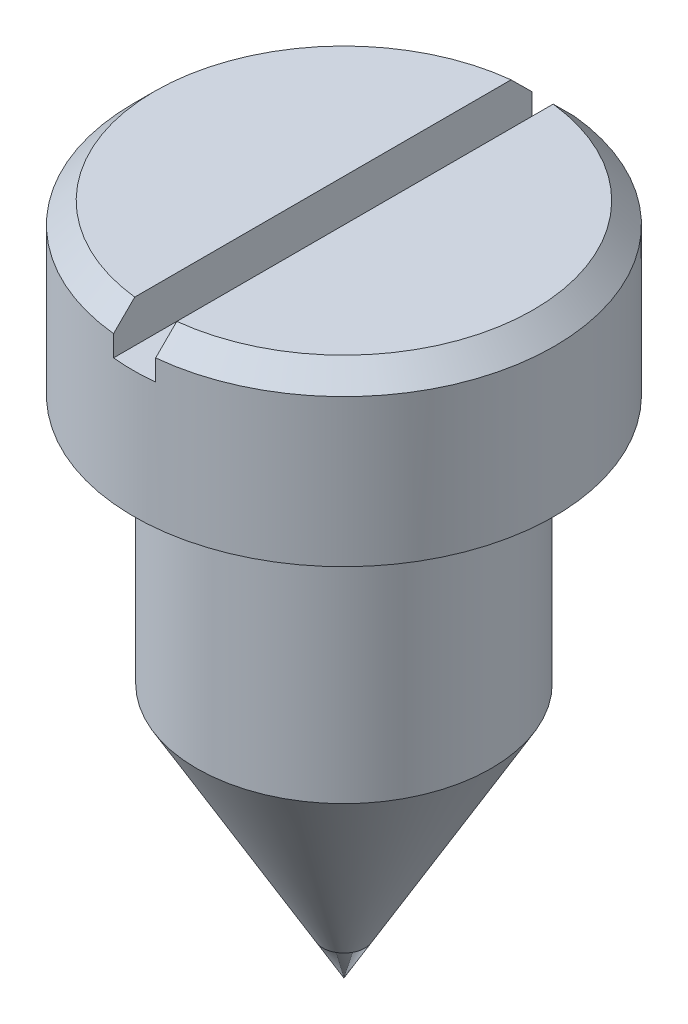
ISO-10303-21;
HEADER;
FILE_DESCRIPTION(('STEP AP214'),'2;1');
FILE_NAME('part.step','',(''),(''),'','','');
FILE_SCHEMA(('AUTOMOTIVE_DESIGN { 1 0 10303 214 1 1 1 1 }'));
ENDSEC;
DATA;
#1=APPLICATION_CONTEXT('core data for automotive mechanical design processes');
#2=APPLICATION_PROTOCOL_DEFINITION('international standard','automotive_design',2000,#1);
#3=PRODUCT_CONTEXT('',#1,'mechanical');
#4=PRODUCT('Part','Part','',(#3));
#5=PRODUCT_RELATED_PRODUCT_CATEGORY('part','',(#4));
#6=PRODUCT_DEFINITION_FORMATION('','',#4);
#7=PRODUCT_DEFINITION_CONTEXT('part definition',#1,'design');
#8=PRODUCT_DEFINITION('design','',#6,#7);
#9=PRODUCT_DEFINITION_SHAPE('','',#8);
#10=(LENGTH_UNIT() NAMED_UNIT(*) SI_UNIT(.MILLI.,.METRE.));
#11=(NAMED_UNIT(*) PLANE_ANGLE_UNIT() SI_UNIT($,.RADIAN.));
#12=(NAMED_UNIT(*) SI_UNIT($,.STERADIAN.) SOLID_ANGLE_UNIT());
#13=UNCERTAINTY_MEASURE_WITH_UNIT(LENGTH_MEASURE(1.E-05),#10,'distance_accuracy_value','');
#14=(GEOMETRIC_REPRESENTATION_CONTEXT(3) GLOBAL_UNCERTAINTY_ASSIGNED_CONTEXT((#13)) GLOBAL_UNIT_ASSIGNED_CONTEXT((#10,
#11,#12)) REPRESENTATION_CONTEXT('',''));
#15=CARTESIAN_POINT('',(0.,0.,0.));
#16=DIRECTION('',(0.,0.,1.));
#17=DIRECTION('',(1.,0.,0.));
#18=AXIS2_PLACEMENT_3D('',#15,#16,#17);
#19=CARTESIAN_POINT('',(5.,16.,0.));
#20=DIRECTION('',(0.,-1.,0.));
#21=DIRECTION('',(1.,0.,0.));
#22=AXIS2_PLACEMENT_3D('',#19,#20,#21);
#23=PLANE('',#22);
#24=CARTESIAN_POINT('',(0.,16.,0.));
#25=DIRECTION('',(0.,-1.,0.));
#26=DIRECTION('',(1.,0.,0.));
#27=AXIS2_PLACEMENT_3D('',#24,#25,#26);
#28=CIRCLE('',#27,4.5);
#29=CARTESIAN_POINT('',(0.5,16.,4.47213595499958));
#30=VERTEX_POINT('',#29);
#31=CARTESIAN_POINT('',(0.5,16.,-4.47213595499958));
#32=VERTEX_POINT('',#31);
#33=EDGE_CURVE('E151',#30,#32,#28,.F.);
#34=ORIENTED_EDGE('',*,*,#33,.T.);
#35=DIRECTION('',(0.,0.,1.));
#36=VECTOR('',#35,1.);
#37=CARTESIAN_POINT('',(0.5,16.,0.));
#38=LINE('',#37,#36);
#39=EDGE_CURVE('E119',#32,#30,#38,.T.);
#40=ORIENTED_EDGE('',*,*,#39,.T.);
#41=EDGE_LOOP('',(#34,#40));
#42=FACE_BOUND('',#41,.T.);
#43=ADVANCED_FACE('F41',(#42),#23,.F.);
#44=CARTESIAN_POINT('',(0.,16.,0.));
#45=DIRECTION('',(0.,-1.,0.));
#46=DIRECTION('',(1.,0.,0.));
#47=AXIS2_PLACEMENT_3D('',#44,#45,#46);
#48=CONICAL_SURFACE('',#47,4.5,0.785398163397447);
#49=CARTESIAN_POINT('',(0.5,15.4993,4.97564071150641));
#50=CARTESIAN_POINT('',(0.5,15.6486362931202,4.8255487609575));
#51=CARTESIAN_POINT('',(0.5,15.7979420463132,4.67542639804808));
#52=CARTESIAN_POINT('',(0.5,16.0964794145826,4.37507417019014));
#53=CARTESIAN_POINT('',(0.5,16.2457110193444,4.22484429498999));
#54=CARTESIAN_POINT('',(0.5,16.5444813312987,3.92383299920542));
#55=CARTESIAN_POINT('',(0.5,16.694019690574,3.77305123316817));
#56=CARTESIAN_POINT('',(0.5,16.9929046527164,3.47133111208202));
#57=CARTESIAN_POINT('',(0.5,17.142251275111,3.32039277637426));
#58=CARTESIAN_POINT('',(0.5,17.4858545688809,2.97254761806295));
#59=CARTESIAN_POINT('',(0.499999999999999,17.6800235002175,2.77555399533727));
#60=CARTESIAN_POINT('',(0.499999999999999,17.9707166779711,2.47943912144982));
#61=CARTESIAN_POINT('',(0.499999999999999,18.0675394981215,2.38061112921131));
#62=CARTESIAN_POINT('',(0.499999999999999,18.2608896355566,2.18267434936266));
#63=CARTESIAN_POINT('',(0.499999999999999,18.3574169648297,2.08356557346705));
#64=CARTESIAN_POINT('',(0.499999999999999,18.5497999906764,1.8851713826513));
#65=CARTESIAN_POINT('',(0.499999999999999,18.6456567568779,1.78588700731163));
#66=CARTESIAN_POINT('',(0.499999999999999,18.8366878224458,1.58663425437869));
#67=CARTESIAN_POINT('',(0.499999999999999,18.9318620130895,1.48666577256574));
#68=CARTESIAN_POINT('',(0.499999999999999,19.1209574605125,1.28567493429638));
#69=CARTESIAN_POINT('',(0.499999999999999,19.214879565198,1.18465338323188));
#70=CARTESIAN_POINT('',(0.499999999999999,19.3539236485399,1.0314715660579));
#71=CARTESIAN_POINT('',(0.499999999999999,19.3999595103523,0.98014258068809));
#72=CARTESIAN_POINT('',(0.499999999999999,19.4910853409493,0.876653535934318));
#73=CARTESIAN_POINT('',(0.499999999999999,19.5361754046692,0.824493560895263));
#74=CARTESIAN_POINT('',(0.499999999999999,19.5981021360247,0.750697887438908));
#75=CARTESIAN_POINT('',(0.499999999999999,19.6155904005098,0.729609551143389));
#76=CARTESIAN_POINT('',(0.499999999999999,19.6502568895439,0.687177526358408));
#77=CARTESIAN_POINT('',(0.499999999999999,19.667435098672,0.665833825255396));
#78=CARTESIAN_POINT('',(0.499999999999999,19.7184559951259,0.601260894504368));
#79=CARTESIAN_POINT('',(0.499999999999999,19.7517172702286,0.557569432540582));
#80=CARTESIAN_POINT('',(0.499999999999999,19.8151043888577,0.469075574852688));
#81=CARTESIAN_POINT('',(0.499999999999999,19.8452754494756,0.424306721749482));
#82=CARTESIAN_POINT('',(0.499999999999999,19.8870061308774,0.35509412489074));
#83=CARTESIAN_POINT('',(0.499999999999999,19.900312979125,0.331713261391649));
#84=CARTESIAN_POINT('',(0.499999999999999,19.9252837532308,0.284097612249944));
#85=CARTESIAN_POINT('',(0.499999999999999,19.9369491309563,0.259863605232308));
#86=CARTESIAN_POINT('',(0.499999999999999,19.9540577087911,0.219654251860777));
#87=CARTESIAN_POINT('',(0.499999999999999,19.9601969337127,0.203977411003732));
#88=CARTESIAN_POINT('',(0.499999999999999,19.9713755603666,0.172237070387167));
#89=CARTESIAN_POINT('',(0.499999999999999,19.976414872655,0.15617353930018));
#90=CARTESIAN_POINT('',(0.499999999999999,19.9894878576618,0.107622738760476));
#91=CARTESIAN_POINT('',(0.499999999999999,19.9955740080711,0.0745602390323407));
#92=CARTESIAN_POINT('',(0.499999999999999,20.0010665746046,0.00747674496532225));
#93=CARTESIAN_POINT('',(0.499999999999999,20.0003971645643,-0.0265508450907743));
#94=CARTESIAN_POINT('',(0.499999999999999,19.9923747707513,-0.0939003718127626));
#95=CARTESIAN_POINT('',(0.499999999999999,19.9849928191224,-0.12721860894651));
#96=CARTESIAN_POINT('',(0.499999999999999,19.9679101069927,-0.183392884883674));
#97=CARTESIAN_POINT('',(0.499999999999999,19.9593836294813,-0.206632741335923));
#98=CARTESIAN_POINT('',(0.499999999999999,19.9403384047716,-0.252291655115592));
#99=CARTESIAN_POINT('',(0.499999999999999,19.9298182383423,-0.274710114071584));
#100=CARTESIAN_POINT('',(0.499999999999999,19.907271573312,-0.318889179156411));
#101=CARTESIAN_POINT('',(0.499999999999999,19.8952385364533,-0.340646387528582));
#102=CARTESIAN_POINT('',(0.499999999999999,19.8700942051218,-0.383510532285601));
#103=CARTESIAN_POINT('',(0.499999999999999,19.8569833412728,-0.404617723782758));
#104=CARTESIAN_POINT('',(0.499999999999999,19.8114880478408,-0.474848363799689));
#105=CARTESIAN_POINT('',(0.499999999999999,19.7772814341244,-0.522783093895099));
#106=CARTESIAN_POINT('',(0.499999999999999,19.7065161684866,-0.616896543236326));
#107=CARTESIAN_POINT('',(0.499999999999999,19.6699553015965,-0.66307354179877));
#108=CARTESIAN_POINT('',(0.499999999999999,19.595336660205,-0.754393204189006));
#109=CARTESIAN_POINT('',(0.499999999999999,19.5572753419569,-0.799532964663511));
#110=CARTESIAN_POINT('',(0.499999999999999,19.4802754555456,-0.889018744780219));
#111=CARTESIAN_POINT('',(0.499999999999999,19.4413372617079,-0.93336508913795));
#112=CARTESIAN_POINT('',(0.499999999999999,19.3626881437261,-1.02170637284883));
#113=CARTESIAN_POINT('',(0.499999999999999,19.3229746282958,-1.06569900034567));
#114=CARTESIAN_POINT('',(0.499999999999999,19.2431122888391,-1.15329466677066));
#115=CARTESIAN_POINT('',(0.499999999999999,19.2029634202663,-1.19689766498246));
#116=CARTESIAN_POINT('',(0.499999999999999,19.082179077046,-1.32713118001123));
#117=CARTESIAN_POINT('',(0.499999999999999,19.0010774069478,-1.41332877717749));
#118=CARTESIAN_POINT('',(0.499999999999999,18.7778044420728,-1.64870019341992));
#119=CARTESIAN_POINT('',(0.499999999999999,18.6349231145921,-1.79719769021445));
#120=CARTESIAN_POINT('',(0.499999999999999,18.3481727707749,-2.09324170238837));
#121=CARTESIAN_POINT('',(0.499999999999999,18.2043037202619,-2.24078818451551));
#122=CARTESIAN_POINT('',(0.499999999999999,17.9158982060305,-2.53544770179503));
#123=CARTESIAN_POINT('',(0.499999999999999,17.7713613168549,-2.68256032036427));
#124=CARTESIAN_POINT('',(0.499999999999999,17.4819520710485,-2.9764508139205));
#125=CARTESIAN_POINT('',(0.5,17.3370797191138,-3.12322869353708));
#126=CARTESIAN_POINT('',(0.5,17.0512513777941,-3.41237886521118));
#127=CARTESIAN_POINT('',(0.5,16.9103016292397,-3.55475732774318));
#128=CARTESIAN_POINT('',(0.5,16.6282557672395,-3.83937045892931));
#129=CARTESIAN_POINT('',(0.5,16.4871596531264,-3.981605126922));
#130=CARTESIAN_POINT('',(0.5,16.2049804321242,-4.26585123011997));
#131=CARTESIAN_POINT('',(0.5,16.0638974130692,-4.40786275253428));
#132=CARTESIAN_POINT('',(0.5,15.7816521114713,-4.69180556602305));
#133=CARTESIAN_POINT('',(0.5,15.6404898293384,-4.83373685750492));
#134=CARTESIAN_POINT('',(0.5,15.4993,-4.97564071150641));
#135=B_SPLINE_CURVE_WITH_KNOTS('',3,(#49,#50,#51,#52,#53,#54,#55,#56,#57,#58,#59,#60,#61,#62,
#63,#64,#65,#66,#67,#68,#69,#70,#71,#72,#73,#74,#75,#76,#77,#78,#79,#80,#81,#82,#83,#84,#85,#86,
#87,#88,#89,#90,#91,#92,#93,#94,#95,#96,#97,#98,#99,#100,#101,#102,#103,#104,#105,#106,#107,
#108,#109,#110,#111,#112,#113,#114,#115,#116,#117,#118,#119,#120,#121,#122,#123,#124,#125,#126,
#127,#128,#129,#130,#131,#132,#133,#134),.UNSPECIFIED.,.F.,.F.,(4,2,2,2,2,2,2,2,2,2,2,2,2,2,2,2,
2,2,2,2,2,2,2,2,2,2,2,2,2,2,2,2,2,2,2,2,2,2,2,2,2,2,4),(0.,0.635185267719648,1.27044249111082,
1.90752301303286,2.54453247739518,3.37433370238715,3.78939310855454,4.20443544587083,
4.6184534827458,5.03253606300764,5.44632230951018,5.65316359974676,5.85998402781756,
5.94217057459955,6.02436119782163,6.18905570878238,6.35082330470936,6.43148778782769,
6.51208046926183,6.56255201051985,6.61302765455151,6.71327782599497,6.81465447171826,
6.91647069365458,6.99063438067792,7.06485106167375,7.13940028772387,7.21391987256934,
7.39041846113854,7.56708560350406,7.74419844720016,7.92123706587644,8.0990323168976,
8.27684593524751,8.63189754428976,9.25010947583751,9.86834290717407,10.4870480188189,
11.1057445209741,11.706781902949,12.3078220371972,12.9083594417888,13.5088937690164),.UNSPECIFIED.);
#136=CARTESIAN_POINT('',(0.5,15.5,4.9749371855331));
#137=VERTEX_POINT('',#136);
#138=EDGE_CURVE('E222',#137,#30,#135,.T.);
#139=ORIENTED_EDGE('',*,*,#138,.F.);
#140=CARTESIAN_POINT('',(0.,15.5,0.));
#141=DIRECTION('',(0.,-1.,0.));
#142=DIRECTION('',(1.,0.,0.));
#143=AXIS2_PLACEMENT_3D('',#140,#141,#142);
#144=CIRCLE('',#143,5.);
#145=CARTESIAN_POINT('',(0.5,15.5,-4.9749371855331));
#146=VERTEX_POINT('',#145);
#147=EDGE_CURVE('E156',#146,#137,#144,.T.);
#148=ORIENTED_EDGE('',*,*,#147,.F.);
#149=EDGE_CURVE('E168',#32,#146,#135,.T.);
#150=ORIENTED_EDGE('',*,*,#149,.F.);
#151=ORIENTED_EDGE('',*,*,#33,.F.);
#152=EDGE_LOOP('',(#139,#148,#150,#151));
#153=FACE_BOUND('',#152,.T.);
#154=ADVANCED_FACE('F199',(#153),#48,.T.);
#155=CARTESIAN_POINT('',(0.,0.,0.));
#156=DIRECTION('',(0.,1.,0.));
#157=DIRECTION('',(-1.,0.,0.));
#158=AXIS2_PLACEMENT_3D('',#155,#156,#157);
#159=CONICAL_SURFACE('',#158,0.,0.523598775598292);
#160=CARTESIAN_POINT('',(0.,6.06217782649116,0.));
#161=DIRECTION('',(0.,1.,0.));
#162=DIRECTION('',(-1.,0.,0.));
#163=AXIS2_PLACEMENT_3D('',#160,#161,#162);
#164=CIRCLE('',#163,3.5);
#165=CARTESIAN_POINT('',(-3.5,6.06217782649116,0.));
#166=VERTEX_POINT('',#165);
#167=EDGE_CURVE('E139',#166,#166,#164,.T.);
#168=ORIENTED_EDGE('',*,*,#167,.F.);
#169=EDGE_LOOP('',(#168));
#170=FACE_BOUND('',#169,.T.);
#171=CARTESIAN_POINT('',(0.,0.,0.));
#172=VERTEX_POINT('',#171);
#173=VERTEX_LOOP('',#172);
#174=FACE_BOUND('',#173,.T.);
#175=ADVANCED_FACE('F196',(#170,#174),#159,.T.);
#176=CARTESIAN_POINT('',(0.,16.,0.));
#177=DIRECTION('',(0.,1.,0.));
#178=DIRECTION('',(-1.,0.,0.));
#179=AXIS2_PLACEMENT_3D('',#176,#177,#178);
#180=CYLINDRICAL_SURFACE('',#179,3.5);
#181=CARTESIAN_POINT('',(0.,11.5,0.));
#182=DIRECTION('',(0.,1.,0.));
#183=DIRECTION('',(-1.,0.,0.));
#184=AXIS2_PLACEMENT_3D('',#181,#182,#183);
#185=CIRCLE('',#184,3.5);
#186=CARTESIAN_POINT('',(-3.5,11.5,0.));
#187=VERTEX_POINT('',#186);
#188=EDGE_CURVE('E147',#187,#187,#185,.F.);
#189=ORIENTED_EDGE('',*,*,#188,.T.);
#190=EDGE_LOOP('',(#189));
#191=FACE_BOUND('',#190,.T.);
#192=ORIENTED_EDGE('',*,*,#167,.T.);
#193=EDGE_LOOP('',(#192));
#194=FACE_BOUND('',#193,.T.);
#195=ADVANCED_FACE('F192',(#191,#194),#180,.T.);
#196=CARTESIAN_POINT('',(3.5,12.,0.));
#197=DIRECTION('',(0.,1.,0.));
#198=DIRECTION('',(-1.,0.,0.));
#199=AXIS2_PLACEMENT_3D('',#196,#197,#198);
#200=PLANE('',#199);
#201=CARTESIAN_POINT('',(0.,12.,0.));
#202=DIRECTION('',(0.,1.,0.));
#203=DIRECTION('',(-1.,0.,0.));
#204=AXIS2_PLACEMENT_3D('',#201,#202,#203);
#205=CIRCLE('',#204,4.);
#206=CARTESIAN_POINT('',(-4.,12.,0.));
#207=VERTEX_POINT('',#206);
#208=EDGE_CURVE('E143',#207,#207,#205,.T.);
#209=ORIENTED_EDGE('',*,*,#208,.T.);
#210=EDGE_LOOP('',(#209));
#211=FACE_BOUND('',#210,.T.);
#212=CARTESIAN_POINT('',(0.,12.,0.));
#213=DIRECTION('',(0.,1.,0.));
#214=DIRECTION('',(-1.,0.,0.));
#215=AXIS2_PLACEMENT_3D('',#212,#213,#214);
#216=CIRCLE('',#215,5.);
#217=CARTESIAN_POINT('',(-5.,12.,0.));
#218=VERTEX_POINT('',#217);
#219=EDGE_CURVE('E135',#218,#218,#216,.T.);
#220=ORIENTED_EDGE('',*,*,#219,.F.);
#221=EDGE_LOOP('',(#220));
#222=FACE_BOUND('',#221,.T.);
#223=ADVANCED_FACE('F189',(#211,#222),#200,.F.);
#224=CARTESIAN_POINT('',(0.,16.,0.));
#225=DIRECTION('',(0.,1.,0.));
#226=DIRECTION('',(-1.,0.,0.));
#227=AXIS2_PLACEMENT_3D('',#224,#225,#226);
#228=CYLINDRICAL_SURFACE('',#227,5.);
#229=CARTESIAN_POINT('',(0.,15.,0.));
#230=DIRECTION('',(0.,-1.,0.));
#231=DIRECTION('',(0.,0.,-1.));
#232=AXIS2_PLACEMENT_3D('',#229,#230,#231);
#233=CIRCLE('',#232,5.);
#234=CARTESIAN_POINT('',(-0.5,15.,-4.9749371855331));
#235=VERTEX_POINT('',#234);
#236=CARTESIAN_POINT('',(0.5,15.,-4.9749371855331));
#237=VERTEX_POINT('',#236);
#238=EDGE_CURVE('E11',#235,#237,#233,.T.);
#239=ORIENTED_EDGE('',*,*,#238,.T.);
#240=DIRECTION('',(0.,1.,0.));
#241=VECTOR('',#240,1.);
#242=CARTESIAN_POINT('',(0.5,16.,-4.9749371855331));
#243=LINE('',#242,#241);
#244=EDGE_CURVE('E124',#237,#146,#243,.T.);
#245=ORIENTED_EDGE('',*,*,#244,.T.);
#246=ORIENTED_EDGE('',*,*,#147,.T.);
#247=DIRECTION('',(0.,1.,0.));
#248=VECTOR('',#247,1.);
#249=CARTESIAN_POINT('',(0.5,16.,4.9749371855331));
#250=LINE('',#249,#248);
#251=CARTESIAN_POINT('',(0.5,15.,4.9749371855331));
#252=VERTEX_POINT('',#251);
#253=EDGE_CURVE('E131',#137,#252,#250,.F.);
#254=ORIENTED_EDGE('',*,*,#253,.T.);
#255=CARTESIAN_POINT('',(-0.5,15.,4.9749371855331));
#256=VERTEX_POINT('',#255);
#257=EDGE_CURVE('E47',#252,#256,#233,.T.);
#258=ORIENTED_EDGE('',*,*,#257,.T.);
#259=DIRECTION('',(0.,1.,0.));
#260=VECTOR('',#259,1.);
#261=CARTESIAN_POINT('',(-0.5,16.,4.9749371855331));
#262=LINE('',#261,#260);
#263=CARTESIAN_POINT('',(-0.5,15.5,4.9749371855331));
#264=VERTEX_POINT('',#263);
#265=EDGE_CURVE('E110',#256,#264,#262,.T.);
#266=ORIENTED_EDGE('',*,*,#265,.T.);
#267=CARTESIAN_POINT('',(-0.5,15.5,-4.9749371855331));
#268=VERTEX_POINT('',#267);
#269=EDGE_CURVE('E117',#264,#268,#144,.T.);
#270=ORIENTED_EDGE('',*,*,#269,.T.);
#271=DIRECTION('',(0.,1.,0.));
#272=VECTOR('',#271,1.);
#273=CARTESIAN_POINT('',(-0.5,16.,-4.9749371855331));
#274=LINE('',#273,#272);
#275=EDGE_CURVE('E107',#268,#235,#274,.F.);
#276=ORIENTED_EDGE('',*,*,#275,.T.);
#277=EDGE_LOOP('',(#239,#245,#246,#254,#258,#266,#270,#276));
#278=FACE_BOUND('',#277,.T.);
#279=ORIENTED_EDGE('',*,*,#219,.T.);
#280=EDGE_LOOP('',(#279));
#281=FACE_BOUND('',#280,.T.);
#282=ADVANCED_FACE('F114',(#278,#281),#228,.T.);
#283=CARTESIAN_POINT('',(-0.5,16.,-4.47213595499958));
#284=VERTEX_POINT('',#283);
#285=CARTESIAN_POINT('',(-0.5,16.,4.47213595499958));
#286=VERTEX_POINT('',#285);
#287=EDGE_CURVE('E155',#284,#286,#28,.F.);
#288=ORIENTED_EDGE('',*,*,#287,.T.);
#289=DIRECTION('',(0.,0.,-1.));
#290=VECTOR('',#289,1.);
#291=CARTESIAN_POINT('',(-0.5,16.,0.));
#292=LINE('',#291,#290);
#293=EDGE_CURVE('E59',#286,#284,#292,.T.);
#294=ORIENTED_EDGE('',*,*,#293,.T.);
#295=EDGE_LOOP('',(#288,#294));
#296=FACE_BOUND('',#295,.T.);
#297=ADVANCED_FACE('F182',(#296),#23,.F.);
#298=CARTESIAN_POINT('',(0.,12.,0.));
#299=DIRECTION('',(0.,1.,0.));
#300=DIRECTION('',(-1.,0.,0.));
#301=AXIS2_PLACEMENT_3D('',#298,#299,#300);
#302=CONICAL_SURFACE('',#301,4.,0.785398163397456);
#303=ORIENTED_EDGE('',*,*,#188,.F.);
#304=EDGE_LOOP('',(#303));
#305=FACE_BOUND('',#304,.T.);
#306=ORIENTED_EDGE('',*,*,#208,.F.);
#307=EDGE_LOOP('',(#306));
#308=FACE_BOUND('',#307,.T.);
#309=ADVANCED_FACE('F185',(#305,#308),#302,.T.);
#310=CARTESIAN_POINT('',(-0.5,15.4993,-4.97564071150641));
#311=CARTESIAN_POINT('',(-0.5,15.6486362931202,-4.8255487609575));
#312=CARTESIAN_POINT('',(-0.5,15.7979420463132,-4.67542639804808));
#313=CARTESIAN_POINT('',(-0.5,16.0964794145826,-4.37507417019013));
#314=CARTESIAN_POINT('',(-0.5,16.2457110193444,-4.22484429498999));
#315=CARTESIAN_POINT('',(-0.5,16.5444813312987,-3.92383299920542));
#316=CARTESIAN_POINT('',(-0.5,16.694019690574,-3.77305123316817));
#317=CARTESIAN_POINT('',(-0.5,16.9929046527164,-3.47133111208202));
#318=CARTESIAN_POINT('',(-0.5,17.142251275111,-3.32039277637426));
#319=CARTESIAN_POINT('',(-0.5,17.4858545688809,-2.97254761806295));
#320=CARTESIAN_POINT('',(-0.500000000000001,17.6800235002175,-2.77555399533727));
#321=CARTESIAN_POINT('',(-0.500000000000001,17.9707166779711,-2.47943912144982));
#322=CARTESIAN_POINT('',(-0.500000000000001,18.0675394981215,-2.38061112921131));
#323=CARTESIAN_POINT('',(-0.500000000000001,18.2608896355566,-2.18267434936266));
#324=CARTESIAN_POINT('',(-0.500000000000001,18.3574169648297,-2.08356557346704));
#325=CARTESIAN_POINT('',(-0.500000000000001,18.5497999906764,-1.8851713826513));
#326=CARTESIAN_POINT('',(-0.500000000000001,18.6456567568779,-1.78588700731163));
#327=CARTESIAN_POINT('',(-0.500000000000001,18.8366878224458,-1.58663425437868));
#328=CARTESIAN_POINT('',(-0.500000000000001,18.9318620130895,-1.48666577256574));
#329=CARTESIAN_POINT('',(-0.500000000000001,19.1209574605125,-1.28567493429638));
#330=CARTESIAN_POINT('',(-0.500000000000001,19.214879565198,-1.18465338323187));
#331=CARTESIAN_POINT('',(-0.500000000000001,19.3539236485399,-1.0314715660579));
#332=CARTESIAN_POINT('',(-0.500000000000001,19.3999595103523,-0.980142580688084));
#333=CARTESIAN_POINT('',(-0.500000000000001,19.4910853409493,-0.876653535934313));
#334=CARTESIAN_POINT('',(-0.500000000000001,19.5361754046692,-0.824493560895259));
#335=CARTESIAN_POINT('',(-0.500000000000001,19.5981021360247,-0.750697887438905));
#336=CARTESIAN_POINT('',(-0.500000000000001,19.6155904005098,-0.729609551143387));
#337=CARTESIAN_POINT('',(-0.500000000000001,19.6502568895439,-0.687177526358406));
#338=CARTESIAN_POINT('',(-0.500000000000001,19.667435098672,-0.665833825255393));
#339=CARTESIAN_POINT('',(-0.500000000000001,19.7184559951259,-0.601260894504365));
#340=CARTESIAN_POINT('',(-0.500000000000001,19.7517172702286,-0.557569432540581));
#341=CARTESIAN_POINT('',(-0.500000000000001,19.8151043888577,-0.469075574852687));
#342=CARTESIAN_POINT('',(-0.500000000000001,19.8452754494756,-0.42430672174948));
#343=CARTESIAN_POINT('',(-0.500000000000001,19.8870061308774,-0.355094124890739));
#344=CARTESIAN_POINT('',(-0.500000000000001,19.900312979125,-0.331713261391648));
#345=CARTESIAN_POINT('',(-0.500000000000001,19.9252837532308,-0.284097612249943));
#346=CARTESIAN_POINT('',(-0.500000000000001,19.9369491309563,-0.259863605232305));
#347=CARTESIAN_POINT('',(-0.500000000000001,19.9540577087911,-0.219654251860775));
#348=CARTESIAN_POINT('',(-0.500000000000001,19.9601969337127,-0.203977411003731));
#349=CARTESIAN_POINT('',(-0.500000000000001,19.9713755603666,-0.172237070387167));
#350=CARTESIAN_POINT('',(-0.500000000000001,19.976414872655,-0.156173539300179));
#351=CARTESIAN_POINT('',(-0.500000000000001,19.9894878576618,-0.107622738760474));
#352=CARTESIAN_POINT('',(-0.500000000000001,19.9955740080711,-0.0745602390323383));
#353=CARTESIAN_POINT('',(-0.500000000000001,20.0010665746046,-0.0074767449653196));
#354=CARTESIAN_POINT('',(-0.500000000000001,20.0003971645643,0.0265508450907767));
#355=CARTESIAN_POINT('',(-0.500000000000001,19.9923747707513,0.093900371812765));
#356=CARTESIAN_POINT('',(-0.500000000000001,19.9849928191224,0.127218608946513));
#357=CARTESIAN_POINT('',(-0.500000000000001,19.9679101069927,0.183392884883677));
#358=CARTESIAN_POINT('',(-0.500000000000001,19.9593836294813,0.206632741335926));
#359=CARTESIAN_POINT('',(-0.500000000000001,19.9403384047716,0.252291655115597));
#360=CARTESIAN_POINT('',(-0.500000000000001,19.9298182383423,0.274710114071589));
#361=CARTESIAN_POINT('',(-0.500000000000001,19.907271573312,0.318889179156417));
#362=CARTESIAN_POINT('',(-0.500000000000001,19.8952385364533,0.340646387528589));
#363=CARTESIAN_POINT('',(-0.500000000000001,19.8700942051218,0.383510532285608));
#364=CARTESIAN_POINT('',(-0.500000000000001,19.8569833412728,0.404617723782765));
#365=CARTESIAN_POINT('',(-0.500000000000001,19.8114880478408,0.474848363799696));
#366=CARTESIAN_POINT('',(-0.500000000000001,19.7772814341244,0.522783093895106));
#367=CARTESIAN_POINT('',(-0.500000000000001,19.7065161684866,0.616896543236334));
#368=CARTESIAN_POINT('',(-0.500000000000001,19.6699553015965,0.663073541798778));
#369=CARTESIAN_POINT('',(-0.500000000000001,19.595336660205,0.754393204189016));
#370=CARTESIAN_POINT('',(-0.500000000000001,19.5572753419569,0.799532964663523));
#371=CARTESIAN_POINT('',(-0.500000000000001,19.4802754555456,0.889018744780232));
#372=CARTESIAN_POINT('',(-0.500000000000001,19.4413372617079,0.933365089137964));
#373=CARTESIAN_POINT('',(-0.500000000000001,19.3626881437261,1.02170637284885));
#374=CARTESIAN_POINT('',(-0.500000000000001,19.3229746282958,1.06569900034568));
#375=CARTESIAN_POINT('',(-0.500000000000001,19.243112288839,1.15329466677068));
#376=CARTESIAN_POINT('',(-0.500000000000001,19.2029634202663,1.19689766498248));
#377=CARTESIAN_POINT('',(-0.500000000000001,19.082179077046,1.32713118001125));
#378=CARTESIAN_POINT('',(-0.500000000000001,19.0010774069477,1.41332877717751));
#379=CARTESIAN_POINT('',(-0.500000000000001,18.7778044420728,1.64870019341994));
#380=CARTESIAN_POINT('',(-0.500000000000001,18.6349231145921,1.79719769021447));
#381=CARTESIAN_POINT('',(-0.500000000000001,18.3481727707748,2.09324170238839));
#382=CARTESIAN_POINT('',(-0.500000000000001,18.2043037202619,2.24078818451553));
#383=CARTESIAN_POINT('',(-0.500000000000001,17.9158982060304,2.53544770179505));
#384=CARTESIAN_POINT('',(-0.500000000000001,17.7713613168548,2.68256032036428));
#385=CARTESIAN_POINT('',(-0.500000000000001,17.4819520710485,2.97645081392051));
#386=CARTESIAN_POINT('',(-0.5,17.3370797191138,3.12322869353709));
#387=CARTESIAN_POINT('',(-0.5,17.0512513777941,3.41237886521119));
#388=CARTESIAN_POINT('',(-0.5,16.9103016292397,3.55475732774319));
#389=CARTESIAN_POINT('',(-0.5,16.6282557672395,3.83937045892932));
#390=CARTESIAN_POINT('',(-0.5,16.4871596531264,3.981605126922));
#391=CARTESIAN_POINT('',(-0.5,16.2049804321242,4.26585123011997));
#392=CARTESIAN_POINT('',(-0.5,16.0638974130692,4.40786275253428));
#393=CARTESIAN_POINT('',(-0.5,15.7816521114713,4.69180556602305));
#394=CARTESIAN_POINT('',(-0.5,15.6404898293384,4.83373685750491));
#395=CARTESIAN_POINT('',(-0.5,15.4993,4.97564071150641));
#396=B_SPLINE_CURVE_WITH_KNOTS('',3,(#310,#311,#312,#313,#314,#315,#316,#317,#318,#319,#320,
#321,#322,#323,#324,#325,#326,#327,#328,#329,#330,#331,#332,#333,#334,#335,#336,#337,#338,#339,
#340,#341,#342,#343,#344,#345,#346,#347,#348,#349,#350,#351,#352,#353,#354,#355,#356,#357,#358,
#359,#360,#361,#362,#363,#364,#365,#366,#367,#368,#369,#370,#371,#372,#373,#374,#375,#376,#377,
#378,#379,#380,#381,#382,#383,#384,#385,#386,#387,#388,#389,#390,#391,#392,#393,#394,#395),
.UNSPECIFIED.,.F.,.F.,(4,2,2,2,2,2,2,2,2,2,2,2,2,2,2,2,2,2,2,2,2,2,2,2,2,2,2,2,2,2,2,2,2,2,2,2,
2,2,2,2,2,2,4),(0.,0.635185267719648,1.27044249111082,1.90752301303286,2.54453247739518,
3.37433370238715,3.78939310855454,4.20443544587083,4.6184534827458,5.03253606300764,
5.44632230951019,5.65316359974677,5.85998402781757,5.94217057459955,6.02436119782163,
6.18905570878238,6.35082330470936,6.43148778782769,6.51208046926183,6.56255201051984,
6.61302765455151,6.71327782599497,6.81465447171826,6.91647069365458,6.99063438067792,
7.06485106167375,7.13940028772387,7.21391987256934,7.39041846113855,7.56708560350406,
7.74419844720018,7.92123706587646,8.09903231689762,8.27684593524753,8.63189754428978,
9.25010947583752,9.86834290717409,10.4870480188189,11.1057445209741,11.706781902949,
12.3078220371972,12.9083594417888,13.5088937690164),.UNSPECIFIED.);
#397=EDGE_CURVE('E167',#268,#284,#396,.T.);
#398=ORIENTED_EDGE('',*,*,#397,.F.);
#399=ORIENTED_EDGE('',*,*,#269,.F.);
#400=EDGE_CURVE('E160',#286,#264,#396,.T.);
#401=ORIENTED_EDGE('',*,*,#400,.F.);
#402=ORIENTED_EDGE('',*,*,#287,.F.);
#403=EDGE_LOOP('',(#398,#399,#401,#402));
#404=FACE_BOUND('',#403,.T.);
#405=ADVANCED_FACE('F44',(#404),#48,.T.);
#406=CARTESIAN_POINT('',(-0.5,15.,-5.));
#407=DIRECTION('',(0.,-1.,0.));
#408=DIRECTION('',(0.,0.,-1.));
#409=AXIS2_PLACEMENT_3D('',#406,#407,#408);
#410=PLANE('',#409);
#411=DIRECTION('',(0.,0.,1.));
#412=VECTOR('',#411,1.);
#413=CARTESIAN_POINT('',(0.5,15.,-5.));
#414=LINE('',#413,#412);
#415=EDGE_CURVE('E101',#237,#252,#414,.T.);
#416=ORIENTED_EDGE('',*,*,#415,.F.);
#417=ORIENTED_EDGE('',*,*,#238,.F.);
#418=DIRECTION('',(0.,0.,1.));
#419=VECTOR('',#418,1.);
#420=CARTESIAN_POINT('',(-0.5,15.,-5.));
#421=LINE('',#420,#419);
#422=EDGE_CURVE('E98',#235,#256,#421,.T.);
#423=ORIENTED_EDGE('',*,*,#422,.T.);
#424=ORIENTED_EDGE('',*,*,#257,.F.);
#425=EDGE_LOOP('',(#416,#417,#423,#424));
#426=FACE_BOUND('',#425,.T.);
#427=ADVANCED_FACE('F97',(#426),#410,.F.);
#428=CARTESIAN_POINT('',(0.5,17.,-5.));
#429=DIRECTION('',(1.,0.,0.));
#430=DIRECTION('',(0.,1.,0.));
#431=AXIS2_PLACEMENT_3D('',#428,#429,#430);
#432=PLANE('',#431);
#433=ORIENTED_EDGE('',*,*,#138,.T.);
#434=ORIENTED_EDGE('',*,*,#39,.F.);
#435=ORIENTED_EDGE('',*,*,#149,.T.);
#436=ORIENTED_EDGE('',*,*,#244,.F.);
#437=ORIENTED_EDGE('',*,*,#415,.T.);
#438=ORIENTED_EDGE('',*,*,#253,.F.);
#439=EDGE_LOOP('',(#433,#434,#435,#436,#437,#438));
#440=FACE_BOUND('',#439,.T.);
#441=ADVANCED_FACE('F177',(#440),#432,.F.);
#442=CARTESIAN_POINT('',(-0.5,17.,-5.));
#443=DIRECTION('',(-1.,0.,0.));
#444=DIRECTION('',(0.,-1.,0.));
#445=AXIS2_PLACEMENT_3D('',#442,#443,#444);
#446=PLANE('',#445);
#447=ORIENTED_EDGE('',*,*,#397,.T.);
#448=ORIENTED_EDGE('',*,*,#293,.F.);
#449=ORIENTED_EDGE('',*,*,#400,.T.);
#450=ORIENTED_EDGE('',*,*,#265,.F.);
#451=ORIENTED_EDGE('',*,*,#422,.F.);
#452=ORIENTED_EDGE('',*,*,#275,.F.);
#453=EDGE_LOOP('',(#447,#448,#449,#450,#451,#452));
#454=FACE_BOUND('',#453,.T.);
#455=ADVANCED_FACE('F106',(#454),#446,.F.);
#456=CLOSED_SHELL('',(#43,#154,#175,#195,#223,#282,#297,#309,#405,#427,#441,#455));
#457=MANIFOLD_SOLID_BREP('B2',#456);
#458=ADVANCED_BREP_SHAPE_REPRESENTATION('',(#18,#457),#14);
#459=SHAPE_DEFINITION_REPRESENTATION(#9,#458);
ENDSEC;
END-ISO-10303-21;
